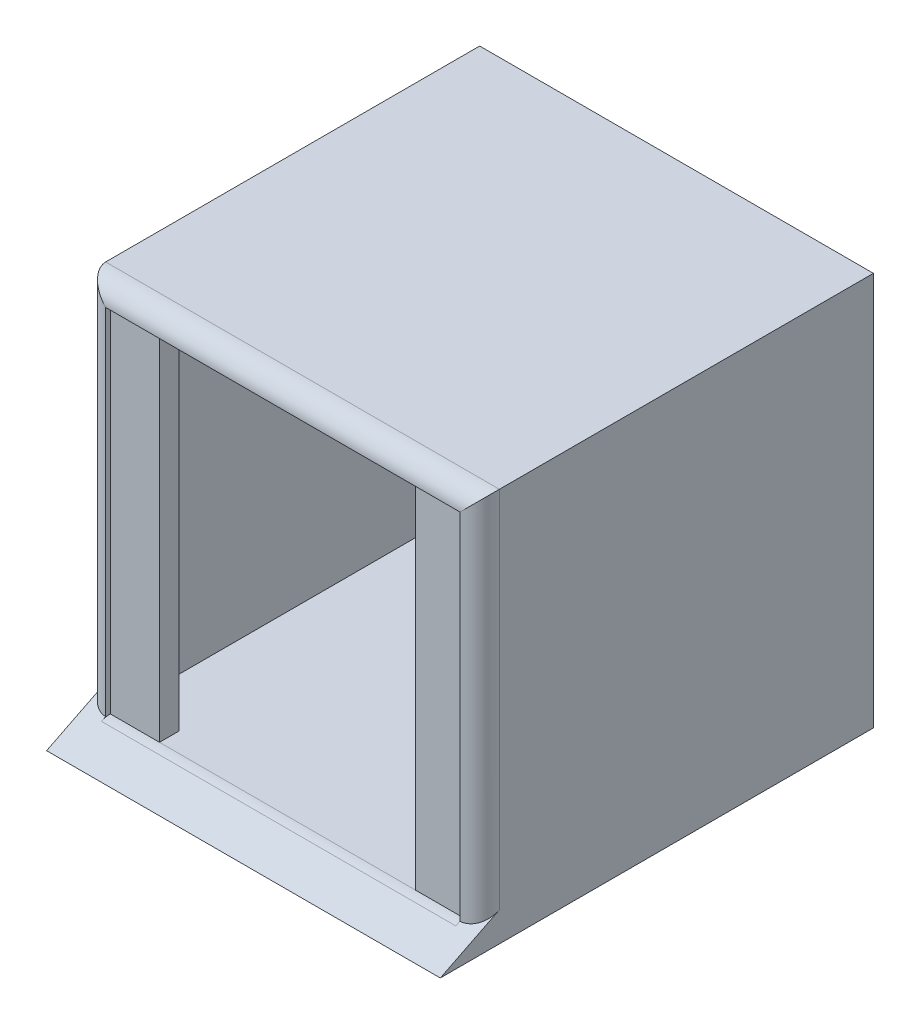
ISO-10303-21;
HEADER;
FILE_DESCRIPTION(('STEP AP214'),'2;1');
FILE_NAME('part.step','',(''),(''),'','','');
FILE_SCHEMA(('AUTOMOTIVE_DESIGN { 1 0 10303 214 1 1 1 1 }'));
ENDSEC;
DATA;
#1=APPLICATION_CONTEXT('core data for automotive mechanical design processes');
#2=APPLICATION_PROTOCOL_DEFINITION('international standard','automotive_design',2000,#1);
#3=PRODUCT_CONTEXT('',#1,'mechanical');
#4=PRODUCT('Part','Part','',(#3));
#5=PRODUCT_RELATED_PRODUCT_CATEGORY('part','',(#4));
#6=PRODUCT_DEFINITION_FORMATION('','',#4);
#7=PRODUCT_DEFINITION_CONTEXT('part definition',#1,'design');
#8=PRODUCT_DEFINITION('design','',#6,#7);
#9=PRODUCT_DEFINITION_SHAPE('','',#8);
#10=(LENGTH_UNIT() NAMED_UNIT(*) SI_UNIT(.MILLI.,.METRE.));
#11=(NAMED_UNIT(*) PLANE_ANGLE_UNIT() SI_UNIT($,.RADIAN.));
#12=(NAMED_UNIT(*) SI_UNIT($,.STERADIAN.) SOLID_ANGLE_UNIT());
#13=UNCERTAINTY_MEASURE_WITH_UNIT(LENGTH_MEASURE(1.E-05),#10,'distance_accuracy_value','');
#14=(GEOMETRIC_REPRESENTATION_CONTEXT(3) GLOBAL_UNCERTAINTY_ASSIGNED_CONTEXT((#13)) GLOBAL_UNIT_ASSIGNED_CONTEXT((#10,
#11,#12)) REPRESENTATION_CONTEXT('',''));
#15=CARTESIAN_POINT('',(0.,0.,0.));
#16=DIRECTION('',(0.,0.,1.));
#17=DIRECTION('',(1.,0.,0.));
#18=AXIS2_PLACEMENT_3D('',#15,#16,#17);
#19=CARTESIAN_POINT('',(0.,1900.,0.));
#20=DIRECTION('',(0.,-1.,0.));
#21=DIRECTION('',(0.,0.,-1.));
#22=AXIS2_PLACEMENT_3D('',#19,#20,#21);
#23=PLANE('',#22);
#24=DIRECTION('',(0.,0.,-1.));
#25=VECTOR('',#24,1.);
#26=CARTESIAN_POINT('',(1900.,1900.,0.));
#27=LINE('',#26,#25);
#28=CARTESIAN_POINT('',(1900.,1900.,-123.606797749979));
#29=VERTEX_POINT('',#28);
#30=CARTESIAN_POINT('',(1900.,1900.,-1900.));
#31=VERTEX_POINT('',#30);
#32=EDGE_CURVE('E261',#29,#31,#27,.T.);
#33=ORIENTED_EDGE('',*,*,#32,.F.);
#34=DIRECTION('',(1.,0.,0.));
#35=VECTOR('',#34,1.);
#36=CARTESIAN_POINT('',(1650.,1900.,-123.606797749979));
#37=LINE('',#36,#35);
#38=CARTESIAN_POINT('',(1650.,1900.,-123.606797749979));
#39=VERTEX_POINT('',#38);
#40=EDGE_CURVE('E53',#39,#29,#37,.T.);
#41=ORIENTED_EDGE('',*,*,#40,.F.);
#42=DIRECTION('',(0.,0.,-1.));
#43=VECTOR('',#42,1.);
#44=CARTESIAN_POINT('',(1650.,1900.,-23.606797749979));
#45=LINE('',#44,#43);
#46=CARTESIAN_POINT('',(1650.,1900.,-23.606797749979));
#47=VERTEX_POINT('',#46);
#48=EDGE_CURVE('E58',#47,#39,#45,.T.);
#49=ORIENTED_EDGE('',*,*,#48,.F.);
#50=DIRECTION('',(-1.,0.,0.));
#51=VECTOR('',#50,1.);
#52=CARTESIAN_POINT('',(1650.,1900.,-23.606797749979));
#53=LINE('',#52,#51);
#54=CARTESIAN_POINT('',(1900.,1900.,-23.606797749979));
#55=VERTEX_POINT('',#54);
#56=EDGE_CURVE('E192',#55,#47,#53,.T.);
#57=ORIENTED_EDGE('',*,*,#56,.F.);
#58=CARTESIAN_POINT('',(1900.,1900.,0.));
#59=VERTEX_POINT('',#58);
#60=EDGE_CURVE('E177',#59,#55,#27,.T.);
#61=ORIENTED_EDGE('',*,*,#60,.F.);
#62=DIRECTION('',(1.,0.,0.));
#63=VECTOR('',#62,1.);
#64=CARTESIAN_POINT('',(0.,1900.,0.));
#65=LINE('',#64,#63);
#66=CARTESIAN_POINT('',(100.,1900.,0.));
#67=VERTEX_POINT('',#66);
#68=EDGE_CURVE('E246',#67,#59,#65,.T.);
#69=ORIENTED_EDGE('',*,*,#68,.F.);
#70=DIRECTION('',(0.,0.,1.));
#71=VECTOR('',#70,1.);
#72=CARTESIAN_POINT('',(100.,1900.,0.));
#73=LINE('',#72,#71);
#74=CARTESIAN_POINT('',(100.,1900.,-23.606797749979));
#75=VERTEX_POINT('',#74);
#76=EDGE_CURVE('E247',#75,#67,#73,.T.);
#77=ORIENTED_EDGE('',*,*,#76,.F.);
#78=DIRECTION('',(-1.,0.,0.));
#79=VECTOR('',#78,1.);
#80=CARTESIAN_POINT('',(100.,1900.,-23.606797749979));
#81=LINE('',#80,#79);
#82=CARTESIAN_POINT('',(350.,1900.,-23.606797749979));
#83=VERTEX_POINT('',#82);
#84=EDGE_CURVE('E206',#83,#75,#81,.T.);
#85=ORIENTED_EDGE('',*,*,#84,.F.);
#86=DIRECTION('',(0.,0.,1.));
#87=VECTOR('',#86,1.);
#88=CARTESIAN_POINT('',(350.,1900.,-23.606797749979));
#89=LINE('',#88,#87);
#90=CARTESIAN_POINT('',(350.,1900.,-123.606797749979));
#91=VERTEX_POINT('',#90);
#92=EDGE_CURVE('E203',#91,#83,#89,.T.);
#93=ORIENTED_EDGE('',*,*,#92,.F.);
#94=DIRECTION('',(1.,0.,0.));
#95=VECTOR('',#94,1.);
#96=CARTESIAN_POINT('',(100.,1900.,-123.606797749979));
#97=LINE('',#96,#95);
#98=CARTESIAN_POINT('',(100.,1900.,-123.606797749979));
#99=VERTEX_POINT('',#98);
#100=EDGE_CURVE('E207',#99,#91,#97,.T.);
#101=ORIENTED_EDGE('',*,*,#100,.F.);
#102=CARTESIAN_POINT('',(100.,1900.,-1900.));
#103=VERTEX_POINT('',#102);
#104=EDGE_CURVE('E243',#103,#99,#73,.T.);
#105=ORIENTED_EDGE('',*,*,#104,.F.);
#106=DIRECTION('',(-1.,0.,0.));
#107=VECTOR('',#106,1.);
#108=CARTESIAN_POINT('',(0.,1900.,-1900.));
#109=LINE('',#108,#107);
#110=EDGE_CURVE('E252',#31,#103,#109,.T.);
#111=ORIENTED_EDGE('',*,*,#110,.F.);
#112=EDGE_LOOP('',(#33,#41,#49,#57,#61,#69,#77,#85,#93,#101,#105,#111));
#113=FACE_BOUND('',#112,.T.);
#114=ADVANCED_FACE('F36',(#113),#23,.T.);
#115=CARTESIAN_POINT('',(0.,100.,0.));
#116=DIRECTION('',(0.,-1.,0.));
#117=DIRECTION('',(0.,0.,-1.));
#118=AXIS2_PLACEMENT_3D('',#115,#116,#117);
#119=PLANE('',#118);
#120=DIRECTION('',(0.,0.,1.));
#121=VECTOR('',#120,1.);
#122=CARTESIAN_POINT('',(1650.,100.,-23.606797749979));
#123=LINE('',#122,#121);
#124=CARTESIAN_POINT('',(1650.,100.,-123.606797749979));
#125=VERTEX_POINT('',#124);
#126=CARTESIAN_POINT('',(1650.,100.,-23.606797749979));
#127=VERTEX_POINT('',#126);
#128=EDGE_CURVE('E189',#125,#127,#123,.T.);
#129=ORIENTED_EDGE('',*,*,#128,.F.);
#130=DIRECTION('',(-1.,0.,0.));
#131=VECTOR('',#130,1.);
#132=CARTESIAN_POINT('',(1650.,100.,-123.606797749979));
#133=LINE('',#132,#131);
#134=CARTESIAN_POINT('',(1900.,100.,-123.606797749979));
#135=VERTEX_POINT('',#134);
#136=EDGE_CURVE('E186',#135,#125,#133,.T.);
#137=ORIENTED_EDGE('',*,*,#136,.F.);
#138=DIRECTION('',(0.,0.,-1.));
#139=VECTOR('',#138,1.);
#140=CARTESIAN_POINT('',(1900.,100.,0.));
#141=LINE('',#140,#139);
#142=CARTESIAN_POINT('',(1900.,100.,-1900.));
#143=VERTEX_POINT('',#142);
#144=EDGE_CURVE('E242',#135,#143,#141,.T.);
#145=ORIENTED_EDGE('',*,*,#144,.T.);
#146=DIRECTION('',(-1.,0.,0.));
#147=VECTOR('',#146,1.);
#148=CARTESIAN_POINT('',(0.,100.,-1900.));
#149=LINE('',#148,#147);
#150=CARTESIAN_POINT('',(100.,100.,-1900.));
#151=VERTEX_POINT('',#150);
#152=EDGE_CURVE('E253',#143,#151,#149,.T.);
#153=ORIENTED_EDGE('',*,*,#152,.T.);
#154=DIRECTION('',(0.,0.,1.));
#155=VECTOR('',#154,1.);
#156=CARTESIAN_POINT('',(100.,100.,0.));
#157=LINE('',#156,#155);
#158=CARTESIAN_POINT('',(100.,100.,-123.606797749979));
#159=VERTEX_POINT('',#158);
#160=EDGE_CURVE('E239',#151,#159,#157,.T.);
#161=ORIENTED_EDGE('',*,*,#160,.T.);
#162=DIRECTION('',(-1.,0.,0.));
#163=VECTOR('',#162,1.);
#164=CARTESIAN_POINT('',(100.,100.,-123.606797749979));
#165=LINE('',#164,#163);
#166=CARTESIAN_POINT('',(350.,100.,-123.606797749979));
#167=VERTEX_POINT('',#166);
#168=EDGE_CURVE('E214',#167,#159,#165,.T.);
#169=ORIENTED_EDGE('',*,*,#168,.F.);
#170=DIRECTION('',(0.,0.,-1.));
#171=VECTOR('',#170,1.);
#172=CARTESIAN_POINT('',(350.,100.,-23.606797749979));
#173=LINE('',#172,#171);
#174=CARTESIAN_POINT('',(350.,100.,-23.606797749979));
#175=VERTEX_POINT('',#174);
#176=EDGE_CURVE('E211',#175,#167,#173,.T.);
#177=ORIENTED_EDGE('',*,*,#176,.F.);
#178=DIRECTION('',(1.,0.,0.));
#179=VECTOR('',#178,1.);
#180=CARTESIAN_POINT('',(0.,100.,-23.606797749979));
#181=LINE('',#180,#179);
#182=EDGE_CURVE('E295',#175,#127,#181,.T.);
#183=ORIENTED_EDGE('',*,*,#182,.T.);
#184=EDGE_LOOP('',(#129,#137,#145,#153,#161,#169,#177,#183));
#185=FACE_BOUND('',#184,.T.);
#186=ADVANCED_FACE('F348',(#185),#119,.F.);
#187=CARTESIAN_POINT('',(1900.,2000.,0.));
#188=DIRECTION('',(-1.,0.,0.));
#189=DIRECTION('',(0.,0.,1.));
#190=AXIS2_PLACEMENT_3D('',#187,#188,#189);
#191=PLANE('',#190);
#192=ORIENTED_EDGE('',*,*,#144,.F.);
#193=DIRECTION('',(0.,-1.,0.));
#194=VECTOR('',#193,1.);
#195=CARTESIAN_POINT('',(1900.,2169.25824035673,-123.606797749979));
#196=LINE('',#195,#194);
#197=EDGE_CURVE('E179',#29,#135,#196,.T.);
#198=ORIENTED_EDGE('',*,*,#197,.F.);
#199=ORIENTED_EDGE('',*,*,#32,.T.);
#200=DIRECTION('',(0.,-1.,0.));
#201=VECTOR('',#200,1.);
#202=CARTESIAN_POINT('',(1900.,2000.,-1900.));
#203=LINE('',#202,#201);
#204=EDGE_CURVE('E251',#31,#143,#203,.T.);
#205=ORIENTED_EDGE('',*,*,#204,.T.);
#206=EDGE_LOOP('',(#192,#198,#199,#205));
#207=FACE_BOUND('',#206,.T.);
#208=ADVANCED_FACE('F372',(#207),#191,.T.);
#209=ORIENTED_EDGE('',*,*,#60,.T.);
#210=DIRECTION('',(0.,-1.,0.));
#211=VECTOR('',#210,1.);
#212=CARTESIAN_POINT('',(1900.,2169.25824035673,-23.606797749979));
#213=LINE('',#212,#211);
#214=CARTESIAN_POINT('',(1900.,100.,-23.606797749979));
#215=VERTEX_POINT('',#214);
#216=EDGE_CURVE('E174',#55,#215,#213,.T.);
#217=ORIENTED_EDGE('',*,*,#216,.T.);
#218=CARTESIAN_POINT('',(1900.,0.,-23.606797749979));
#219=DIRECTION('',(-1.,0.,0.));
#220=DIRECTION('',(0.,0.,1.));
#221=AXIS2_PLACEMENT_3D('',#218,#219,#220);
#222=CIRCLE('',#221,100.);
#223=CARTESIAN_POINT('',(1900.,89.4427190999916,21.1145618000168));
#224=VERTEX_POINT('',#223);
#225=EDGE_CURVE('E45',#215,#224,#222,.F.);
#226=ORIENTED_EDGE('',*,*,#225,.T.);
#227=DIRECTION('',(0.,-0.447213595499958,0.894427190999916));
#228=VECTOR('',#227,1.);
#229=CARTESIAN_POINT('',(1900.,480.,-760.));
#230=LINE('',#229,#228);
#231=CARTESIAN_POINT('',(1900.,100.,0.));
#232=VERTEX_POINT('',#231);
#233=EDGE_CURVE('E303',#232,#224,#230,.T.);
#234=ORIENTED_EDGE('',*,*,#233,.F.);
#235=DIRECTION('',(0.,-1.,0.));
#236=VECTOR('',#235,1.);
#237=CARTESIAN_POINT('',(1900.,2000.,0.));
#238=LINE('',#237,#236);
#239=EDGE_CURVE('E258',#59,#232,#238,.T.);
#240=ORIENTED_EDGE('',*,*,#239,.F.);
#241=EDGE_LOOP('',(#209,#217,#226,#234,#240));
#242=FACE_BOUND('',#241,.T.);
#243=ADVANCED_FACE('F175',(#242),#191,.T.);
#244=CARTESIAN_POINT('',(100.,2000.,0.));
#245=DIRECTION('',(1.,0.,0.));
#246=DIRECTION('',(0.,0.,-1.));
#247=AXIS2_PLACEMENT_3D('',#244,#245,#246);
#248=PLANE('',#247);
#249=ORIENTED_EDGE('',*,*,#104,.T.);
#250=DIRECTION('',(0.,-1.,0.));
#251=VECTOR('',#250,1.);
#252=CARTESIAN_POINT('',(100.,2169.25824035673,-123.606797749979));
#253=LINE('',#252,#251);
#254=EDGE_CURVE('E217',#99,#159,#253,.T.);
#255=ORIENTED_EDGE('',*,*,#254,.T.);
#256=ORIENTED_EDGE('',*,*,#160,.F.);
#257=DIRECTION('',(0.,-1.,0.));
#258=VECTOR('',#257,1.);
#259=CARTESIAN_POINT('',(100.,2000.,-1900.));
#260=LINE('',#259,#258);
#261=EDGE_CURVE('E248',#103,#151,#260,.T.);
#262=ORIENTED_EDGE('',*,*,#261,.F.);
#263=EDGE_LOOP('',(#249,#255,#256,#262));
#264=FACE_BOUND('',#263,.T.);
#265=ADVANCED_FACE('F364',(#264),#248,.T.);
#266=CARTESIAN_POINT('',(100.,0.,-23.606797749979));
#267=DIRECTION('',(1.,0.,0.));
#268=DIRECTION('',(0.,0.,-1.));
#269=AXIS2_PLACEMENT_3D('',#266,#267,#268);
#270=CIRCLE('',#269,100.);
#271=CARTESIAN_POINT('',(100.,89.4427190999916,21.1145618000168));
#272=VERTEX_POINT('',#271);
#273=CARTESIAN_POINT('',(100.,100.,-23.606797749979));
#274=VERTEX_POINT('',#273);
#275=EDGE_CURVE('E11',#272,#274,#270,.F.);
#276=ORIENTED_EDGE('',*,*,#275,.T.);
#277=DIRECTION('',(0.,-1.,0.));
#278=VECTOR('',#277,1.);
#279=CARTESIAN_POINT('',(100.,2169.25824035673,-23.606797749979));
#280=LINE('',#279,#278);
#281=EDGE_CURVE('E225',#75,#274,#280,.T.);
#282=ORIENTED_EDGE('',*,*,#281,.F.);
#283=ORIENTED_EDGE('',*,*,#76,.T.);
#284=DIRECTION('',(0.,-1.,0.));
#285=VECTOR('',#284,1.);
#286=CARTESIAN_POINT('',(100.,2000.,0.));
#287=LINE('',#286,#285);
#288=CARTESIAN_POINT('',(100.,100.,0.));
#289=VERTEX_POINT('',#288);
#290=EDGE_CURVE('E262',#67,#289,#287,.T.);
#291=ORIENTED_EDGE('',*,*,#290,.T.);
#292=DIRECTION('',(0.,0.447213595499958,-0.894427190999916));
#293=VECTOR('',#292,1.);
#294=CARTESIAN_POINT('',(100.,480.,-760.));
#295=LINE('',#294,#293);
#296=EDGE_CURVE('E299',#272,#289,#295,.T.);
#297=ORIENTED_EDGE('',*,*,#296,.F.);
#298=EDGE_LOOP('',(#276,#282,#283,#291,#297));
#299=FACE_BOUND('',#298,.T.);
#300=ADVANCED_FACE('F341',(#299),#248,.T.);
#301=CARTESIAN_POINT('',(0.,2000.,0.));
#302=DIRECTION('',(1.,0.,0.));
#303=DIRECTION('',(0.,0.,-1.));
#304=AXIS2_PLACEMENT_3D('',#301,#302,#303);
#305=PLANE('',#304);
#306=DIRECTION('',(0.,-0.447213595499958,0.894427190999916));
#307=VECTOR('',#306,1.);
#308=CARTESIAN_POINT('',(0.,100.,0.));
#309=LINE('',#308,#307);
#310=CARTESIAN_POINT('',(0.,150.,-100.));
#311=VERTEX_POINT('',#310);
#312=CARTESIAN_POINT('',(0.,0.,200.));
#313=VERTEX_POINT('',#312);
#314=EDGE_CURVE('E234',#311,#313,#309,.T.);
#315=ORIENTED_EDGE('',*,*,#314,.F.);
#316=DIRECTION('',(0.,-1.,0.));
#317=VECTOR('',#316,1.);
#318=CARTESIAN_POINT('',(0.,2000.,-100.));
#319=LINE('',#318,#317);
#320=CARTESIAN_POINT('',(0.,2000.,-100.));
#321=VERTEX_POINT('',#320);
#322=EDGE_CURVE('E288',#311,#321,#319,.F.);
#323=ORIENTED_EDGE('',*,*,#322,.T.);
#324=DIRECTION('',(0.,0.,1.));
#325=VECTOR('',#324,1.);
#326=CARTESIAN_POINT('',(0.,2000.,0.));
#327=LINE('',#326,#325);
#328=CARTESIAN_POINT('',(0.,2000.,-2000.));
#329=VERTEX_POINT('',#328);
#330=EDGE_CURVE('E270',#329,#321,#327,.T.);
#331=ORIENTED_EDGE('',*,*,#330,.F.);
#332=DIRECTION('',(0.,-1.,0.));
#333=VECTOR('',#332,1.);
#334=CARTESIAN_POINT('',(0.,2000.,-2000.));
#335=LINE('',#334,#333);
#336=CARTESIAN_POINT('',(0.,0.,-2000.));
#337=VERTEX_POINT('',#336);
#338=EDGE_CURVE('E278',#329,#337,#335,.T.);
#339=ORIENTED_EDGE('',*,*,#338,.T.);
#340=DIRECTION('',(0.,0.,1.));
#341=VECTOR('',#340,1.);
#342=CARTESIAN_POINT('',(0.,0.,0.));
#343=LINE('',#342,#341);
#344=EDGE_CURVE('E265',#337,#313,#343,.T.);
#345=ORIENTED_EDGE('',*,*,#344,.T.);
#346=EDGE_LOOP('',(#315,#323,#331,#339,#345));
#347=FACE_BOUND('',#346,.T.);
#348=ADVANCED_FACE('F335',(#347),#305,.F.);
#349=CARTESIAN_POINT('',(2000.,2000.,0.));
#350=DIRECTION('',(-1.,0.,0.));
#351=DIRECTION('',(0.,0.,1.));
#352=AXIS2_PLACEMENT_3D('',#349,#350,#351);
#353=PLANE('',#352);
#354=DIRECTION('',(0.,0.,-1.));
#355=VECTOR('',#354,1.);
#356=CARTESIAN_POINT('',(2000.,2000.,0.));
#357=LINE('',#356,#355);
#358=CARTESIAN_POINT('',(2000.,2000.,-100.));
#359=VERTEX_POINT('',#358);
#360=CARTESIAN_POINT('',(2000.,2000.,-2000.));
#361=VERTEX_POINT('',#360);
#362=EDGE_CURVE('E273',#359,#361,#357,.T.);
#363=ORIENTED_EDGE('',*,*,#362,.F.);
#364=DIRECTION('',(0.,-1.,0.));
#365=VECTOR('',#364,1.);
#366=CARTESIAN_POINT('',(2000.,2000.,-100.));
#367=LINE('',#366,#365);
#368=CARTESIAN_POINT('',(2000.,150.,-100.));
#369=VERTEX_POINT('',#368);
#370=EDGE_CURVE('E290',#359,#369,#367,.T.);
#371=ORIENTED_EDGE('',*,*,#370,.T.);
#372=DIRECTION('',(0.,-0.447213595499958,0.894427190999916));
#373=VECTOR('',#372,1.);
#374=CARTESIAN_POINT('',(2000.,100.,0.));
#375=LINE('',#374,#373);
#376=CARTESIAN_POINT('',(2000.,0.,200.));
#377=VERTEX_POINT('',#376);
#378=EDGE_CURVE('E230',#369,#377,#375,.T.);
#379=ORIENTED_EDGE('',*,*,#378,.T.);
#380=DIRECTION('',(0.,0.,-1.));
#381=VECTOR('',#380,1.);
#382=CARTESIAN_POINT('',(2000.,0.,0.));
#383=LINE('',#382,#381);
#384=CARTESIAN_POINT('',(2000.,0.,-2000.));
#385=VERTEX_POINT('',#384);
#386=EDGE_CURVE('E280',#377,#385,#383,.T.);
#387=ORIENTED_EDGE('',*,*,#386,.T.);
#388=DIRECTION('',(0.,-1.,0.));
#389=VECTOR('',#388,1.);
#390=CARTESIAN_POINT('',(2000.,2000.,-2000.));
#391=LINE('',#390,#389);
#392=EDGE_CURVE('E285',#361,#385,#391,.T.);
#393=ORIENTED_EDGE('',*,*,#392,.F.);
#394=EDGE_LOOP('',(#363,#371,#379,#387,#393));
#395=FACE_BOUND('',#394,.T.);
#396=ADVANCED_FACE('F326',(#395),#353,.F.);
#397=CARTESIAN_POINT('',(0.,2000.,-2000.));
#398=DIRECTION('',(0.,0.,1.));
#399=DIRECTION('',(1.,0.,0.));
#400=AXIS2_PLACEMENT_3D('',#397,#398,#399);
#401=PLANE('',#400);
#402=DIRECTION('',(-1.,0.,0.));
#403=VECTOR('',#402,1.);
#404=CARTESIAN_POINT('',(0.,0.,-2000.));
#405=LINE('',#404,#403);
#406=EDGE_CURVE('E274',#385,#337,#405,.T.);
#407=ORIENTED_EDGE('',*,*,#406,.T.);
#408=ORIENTED_EDGE('',*,*,#338,.F.);
#409=DIRECTION('',(-1.,0.,0.));
#410=VECTOR('',#409,1.);
#411=CARTESIAN_POINT('',(0.,2000.,-2000.));
#412=LINE('',#411,#410);
#413=EDGE_CURVE('E276',#361,#329,#412,.T.);
#414=ORIENTED_EDGE('',*,*,#413,.F.);
#415=ORIENTED_EDGE('',*,*,#392,.T.);
#416=EDGE_LOOP('',(#407,#408,#414,#415));
#417=FACE_BOUND('',#416,.T.);
#418=ADVANCED_FACE('F390',(#417),#401,.F.);
#419=CARTESIAN_POINT('',(0.,2000.,0.));
#420=DIRECTION('',(0.,-1.,0.));
#421=DIRECTION('',(0.,0.,-1.));
#422=AXIS2_PLACEMENT_3D('',#419,#420,#421);
#423=PLANE('',#422);
#424=ORIENTED_EDGE('',*,*,#330,.T.);
#425=DIRECTION('',(1.,0.,0.));
#426=VECTOR('',#425,1.);
#427=CARTESIAN_POINT('',(0.,2000.,-100.));
#428=LINE('',#427,#426);
#429=EDGE_CURVE('E293',#321,#359,#428,.T.);
#430=ORIENTED_EDGE('',*,*,#429,.T.);
#431=ORIENTED_EDGE('',*,*,#362,.T.);
#432=ORIENTED_EDGE('',*,*,#413,.T.);
#433=EDGE_LOOP('',(#424,#430,#431,#432));
#434=FACE_BOUND('',#433,.T.);
#435=ADVANCED_FACE('F331',(#434),#423,.F.);
#436=CARTESIAN_POINT('',(0.,0.,0.));
#437=DIRECTION('',(0.,-1.,0.));
#438=DIRECTION('',(0.,0.,-1.));
#439=AXIS2_PLACEMENT_3D('',#436,#437,#438);
#440=PLANE('',#439);
#441=ORIENTED_EDGE('',*,*,#344,.F.);
#442=ORIENTED_EDGE('',*,*,#406,.F.);
#443=ORIENTED_EDGE('',*,*,#386,.F.);
#444=DIRECTION('',(-1.,0.,0.));
#445=VECTOR('',#444,1.);
#446=CARTESIAN_POINT('',(2000.,0.,200.));
#447=LINE('',#446,#445);
#448=EDGE_CURVE('E233',#377,#313,#447,.T.);
#449=ORIENTED_EDGE('',*,*,#448,.T.);
#450=EDGE_LOOP('',(#441,#442,#443,#449));
#451=FACE_BOUND('',#450,.T.);
#452=ADVANCED_FACE('F389',(#451),#440,.T.);
#453=CARTESIAN_POINT('',(0.,2000.,-1900.));
#454=DIRECTION('',(0.,0.,1.));
#455=DIRECTION('',(1.,0.,0.));
#456=AXIS2_PLACEMENT_3D('',#453,#454,#455);
#457=PLANE('',#456);
#458=ORIENTED_EDGE('',*,*,#152,.F.);
#459=ORIENTED_EDGE('',*,*,#204,.F.);
#460=ORIENTED_EDGE('',*,*,#110,.T.);
#461=ORIENTED_EDGE('',*,*,#261,.T.);
#462=EDGE_LOOP('',(#458,#459,#460,#461));
#463=FACE_BOUND('',#462,.T.);
#464=ADVANCED_FACE('F369',(#463),#457,.T.);
#465=CARTESIAN_POINT('',(2000.,100.,0.));
#466=DIRECTION('',(0.,-0.894427190999916,-0.447213595499958));
#467=DIRECTION('',(0.,0.447213595499958,-0.894427190999916));
#468=AXIS2_PLACEMENT_3D('',#465,#466,#467);
#469=PLANE('',#468);
#470=ORIENTED_EDGE('',*,*,#378,.F.);
#471=CARTESIAN_POINT('',(1900.,150.,-100.));
#472=DIRECTION('',(0.,-0.894427190999916,-0.447213595499958));
#473=DIRECTION('',(0.,-0.447213595499958,0.894427190999916));
#474=AXIS2_PLACEMENT_3D('',#471,#472,#473);
#475=ELLIPSE('',#474,111.803398874989,100.);
#476=EDGE_CURVE('E170',#369,#232,#475,.T.);
#477=ORIENTED_EDGE('',*,*,#476,.T.);
#478=ORIENTED_EDGE('',*,*,#233,.T.);
#479=DIRECTION('',(1.,0.,0.));
#480=VECTOR('',#479,1.);
#481=CARTESIAN_POINT('',(2000.,89.4427190999916,21.1145618000168));
#482=LINE('',#481,#480);
#483=EDGE_CURVE('E167',#224,#272,#482,.F.);
#484=ORIENTED_EDGE('',*,*,#483,.T.);
#485=ORIENTED_EDGE('',*,*,#296,.T.);
#486=CARTESIAN_POINT('',(100.,150.,-100.));
#487=DIRECTION('',(0.,-0.894427190999916,-0.447213595499958));
#488=DIRECTION('',(0.,-0.447213595499958,0.894427190999916));
#489=AXIS2_PLACEMENT_3D('',#486,#487,#488);
#490=ELLIPSE('',#489,111.803398874989,100.);
#491=EDGE_CURVE('E305',#289,#311,#490,.T.);
#492=ORIENTED_EDGE('',*,*,#491,.T.);
#493=ORIENTED_EDGE('',*,*,#314,.T.);
#494=ORIENTED_EDGE('',*,*,#448,.F.);
#495=EDGE_LOOP('',(#470,#477,#478,#484,#485,#492,#493,#494));
#496=FACE_BOUND('',#495,.T.);
#497=ADVANCED_FACE('F339',(#496),#469,.F.);
#498=CARTESIAN_POINT('',(1900.,2000.,-100.));
#499=DIRECTION('',(0.,-1.,0.));
#500=DIRECTION('',(0.,0.,-1.));
#501=AXIS2_PLACEMENT_3D('',#498,#499,#500);
#502=CYLINDRICAL_SURFACE('',#501,100.);
#503=ORIENTED_EDGE('',*,*,#476,.F.);
#504=ORIENTED_EDGE('',*,*,#370,.F.);
#505=CARTESIAN_POINT('',(1900.,1900.,-100.));
#506=DIRECTION('',(0.707106781186547,-0.707106781186547,0.));
#507=DIRECTION('',(0.707106781186547,0.707106781186547,0.));
#508=AXIS2_PLACEMENT_3D('',#505,#506,#507);
#509=ELLIPSE('',#508,141.42135623731,100.);
#510=EDGE_CURVE('E40',#59,#359,#509,.F.);
#511=ORIENTED_EDGE('',*,*,#510,.F.);
#512=ORIENTED_EDGE('',*,*,#239,.T.);
#513=EDGE_LOOP('',(#503,#504,#511,#512));
#514=FACE_BOUND('',#513,.T.);
#515=ADVANCED_FACE('F323',(#514),#502,.T.);
#516=CARTESIAN_POINT('',(0.,1900.,-100.));
#517=DIRECTION('',(1.,0.,0.));
#518=DIRECTION('',(0.,0.,-1.));
#519=AXIS2_PLACEMENT_3D('',#516,#517,#518);
#520=CYLINDRICAL_SURFACE('',#519,100.);
#521=ORIENTED_EDGE('',*,*,#510,.T.);
#522=ORIENTED_EDGE('',*,*,#429,.F.);
#523=CARTESIAN_POINT('',(100.,1900.,-100.));
#524=DIRECTION('',(0.707106781186547,0.707106781186547,0.));
#525=DIRECTION('',(0.707106781186547,-0.707106781186547,0.));
#526=AXIS2_PLACEMENT_3D('',#523,#524,#525);
#527=ELLIPSE('',#526,141.42135623731,100.);
#528=EDGE_CURVE('E210',#67,#321,#527,.F.);
#529=ORIENTED_EDGE('',*,*,#528,.F.);
#530=ORIENTED_EDGE('',*,*,#68,.T.);
#531=EDGE_LOOP('',(#521,#522,#529,#530));
#532=FACE_BOUND('',#531,.T.);
#533=ADVANCED_FACE('F318',(#532),#520,.T.);
#534=CARTESIAN_POINT('',(100.,2000.,-100.));
#535=DIRECTION('',(0.,-1.,0.));
#536=DIRECTION('',(0.,0.,-1.));
#537=AXIS2_PLACEMENT_3D('',#534,#535,#536);
#538=CYLINDRICAL_SURFACE('',#537,100.);
#539=ORIENTED_EDGE('',*,*,#528,.T.);
#540=ORIENTED_EDGE('',*,*,#322,.F.);
#541=ORIENTED_EDGE('',*,*,#491,.F.);
#542=ORIENTED_EDGE('',*,*,#290,.F.);
#543=EDGE_LOOP('',(#539,#540,#541,#542));
#544=FACE_BOUND('',#543,.T.);
#545=ADVANCED_FACE('F337',(#544),#538,.T.);
#546=CARTESIAN_POINT('',(0.,0.,-23.606797749979));
#547=DIRECTION('',(1.,0.,0.));
#548=DIRECTION('',(0.,0.,-1.));
#549=AXIS2_PLACEMENT_3D('',#546,#547,#548);
#550=CYLINDRICAL_SURFACE('',#549,100.);
#551=ORIENTED_EDGE('',*,*,#275,.F.);
#552=ORIENTED_EDGE('',*,*,#483,.F.);
#553=ORIENTED_EDGE('',*,*,#225,.F.);
#554=DIRECTION('',(1.,0.,0.));
#555=VECTOR('',#554,1.);
#556=CARTESIAN_POINT('',(1650.,100.,-23.606797749979));
#557=LINE('',#556,#555);
#558=EDGE_CURVE('E164',#127,#215,#557,.T.);
#559=ORIENTED_EDGE('',*,*,#558,.F.);
#560=ORIENTED_EDGE('',*,*,#182,.F.);
#561=EDGE_CURVE('E296',#274,#175,#181,.T.);
#562=ORIENTED_EDGE('',*,*,#561,.F.);
#563=EDGE_LOOP('',(#551,#552,#553,#559,#560,#562));
#564=FACE_BOUND('',#563,.T.);
#565=ADVANCED_FACE('F38',(#564),#550,.T.);
#566=CARTESIAN_POINT('',(100.,2169.25824035673,-123.606797749979));
#567=DIRECTION('',(0.,0.,1.));
#568=DIRECTION('',(1.,0.,0.));
#569=AXIS2_PLACEMENT_3D('',#566,#567,#568);
#570=PLANE('',#569);
#571=ORIENTED_EDGE('',*,*,#254,.F.);
#572=ORIENTED_EDGE('',*,*,#100,.T.);
#573=DIRECTION('',(0.,-1.,0.));
#574=VECTOR('',#573,1.);
#575=CARTESIAN_POINT('',(350.,2169.25824035673,-123.606797749979));
#576=LINE('',#575,#574);
#577=EDGE_CURVE('E219',#91,#167,#576,.T.);
#578=ORIENTED_EDGE('',*,*,#577,.T.);
#579=ORIENTED_EDGE('',*,*,#168,.T.);
#580=EDGE_LOOP('',(#571,#572,#578,#579));
#581=FACE_BOUND('',#580,.T.);
#582=ADVANCED_FACE('F361',(#581),#570,.F.);
#583=CARTESIAN_POINT('',(350.,2169.25824035673,-23.606797749979));
#584=DIRECTION('',(-1.,0.,0.));
#585=DIRECTION('',(0.,0.,1.));
#586=AXIS2_PLACEMENT_3D('',#583,#584,#585);
#587=PLANE('',#586);
#588=ORIENTED_EDGE('',*,*,#577,.F.);
#589=ORIENTED_EDGE('',*,*,#92,.T.);
#590=DIRECTION('',(0.,-1.,0.));
#591=VECTOR('',#590,1.);
#592=CARTESIAN_POINT('',(350.,2169.25824035673,-23.606797749979));
#593=LINE('',#592,#591);
#594=EDGE_CURVE('E222',#83,#175,#593,.T.);
#595=ORIENTED_EDGE('',*,*,#594,.T.);
#596=ORIENTED_EDGE('',*,*,#176,.T.);
#597=EDGE_LOOP('',(#588,#589,#595,#596));
#598=FACE_BOUND('',#597,.T.);
#599=ADVANCED_FACE('F358',(#598),#587,.F.);
#600=CARTESIAN_POINT('',(100.,2169.25824035673,-23.606797749979));
#601=DIRECTION('',(0.,0.,-1.));
#602=DIRECTION('',(-1.,0.,0.));
#603=AXIS2_PLACEMENT_3D('',#600,#601,#602);
#604=PLANE('',#603);
#605=ORIENTED_EDGE('',*,*,#594,.F.);
#606=ORIENTED_EDGE('',*,*,#84,.T.);
#607=ORIENTED_EDGE('',*,*,#281,.T.);
#608=ORIENTED_EDGE('',*,*,#561,.T.);
#609=EDGE_LOOP('',(#605,#606,#607,#608));
#610=FACE_BOUND('',#609,.T.);
#611=ADVANCED_FACE('F354',(#610),#604,.F.);
#612=CARTESIAN_POINT('',(1650.,2169.25824035673,-23.606797749979));
#613=DIRECTION('',(1.,0.,0.));
#614=DIRECTION('',(0.,0.,-1.));
#615=AXIS2_PLACEMENT_3D('',#612,#613,#614);
#616=PLANE('',#615);
#617=DIRECTION('',(0.,-1.,0.));
#618=VECTOR('',#617,1.);
#619=CARTESIAN_POINT('',(1650.,2169.25824035673,-23.606797749979));
#620=LINE('',#619,#618);
#621=EDGE_CURVE('E184',#47,#127,#620,.T.);
#622=ORIENTED_EDGE('',*,*,#621,.F.);
#623=ORIENTED_EDGE('',*,*,#48,.T.);
#624=DIRECTION('',(0.,-1.,0.));
#625=VECTOR('',#624,1.);
#626=CARTESIAN_POINT('',(1650.,2169.25824035673,-123.606797749979));
#627=LINE('',#626,#625);
#628=EDGE_CURVE('E197',#39,#125,#627,.T.);
#629=ORIENTED_EDGE('',*,*,#628,.T.);
#630=ORIENTED_EDGE('',*,*,#128,.T.);
#631=EDGE_LOOP('',(#622,#623,#629,#630));
#632=FACE_BOUND('',#631,.T.);
#633=ADVANCED_FACE('F346',(#632),#616,.F.);
#634=CARTESIAN_POINT('',(1650.,2169.25824035673,-123.606797749979));
#635=DIRECTION('',(0.,0.,1.));
#636=DIRECTION('',(1.,0.,0.));
#637=AXIS2_PLACEMENT_3D('',#634,#635,#636);
#638=PLANE('',#637);
#639=ORIENTED_EDGE('',*,*,#628,.F.);
#640=ORIENTED_EDGE('',*,*,#40,.T.);
#641=ORIENTED_EDGE('',*,*,#197,.T.);
#642=ORIENTED_EDGE('',*,*,#136,.T.);
#643=EDGE_LOOP('',(#639,#640,#641,#642));
#644=FACE_BOUND('',#643,.T.);
#645=ADVANCED_FACE('F344',(#644),#638,.F.);
#646=CARTESIAN_POINT('',(1650.,2169.25824035673,-23.606797749979));
#647=DIRECTION('',(0.,0.,-1.));
#648=DIRECTION('',(-1.,0.,0.));
#649=AXIS2_PLACEMENT_3D('',#646,#647,#648);
#650=PLANE('',#649);
#651=ORIENTED_EDGE('',*,*,#216,.F.);
#652=ORIENTED_EDGE('',*,*,#56,.T.);
#653=ORIENTED_EDGE('',*,*,#621,.T.);
#654=ORIENTED_EDGE('',*,*,#558,.T.);
#655=EDGE_LOOP('',(#651,#652,#653,#654));
#656=FACE_BOUND('',#655,.T.);
#657=ADVANCED_FACE('F182',(#656),#650,.F.);
#658=CLOSED_SHELL('',(#114,#186,#208,#243,#265,#300,#348,#396,#418,#435,#452,#464,#497,#515,
#533,#545,#565,#582,#599,#611,#633,#645,#657));
#659=MANIFOLD_SOLID_BREP('B2',#658);
#660=ADVANCED_BREP_SHAPE_REPRESENTATION('',(#18,#659),#14);
#661=SHAPE_DEFINITION_REPRESENTATION(#9,#660);
ENDSEC;
END-ISO-10303-21;
